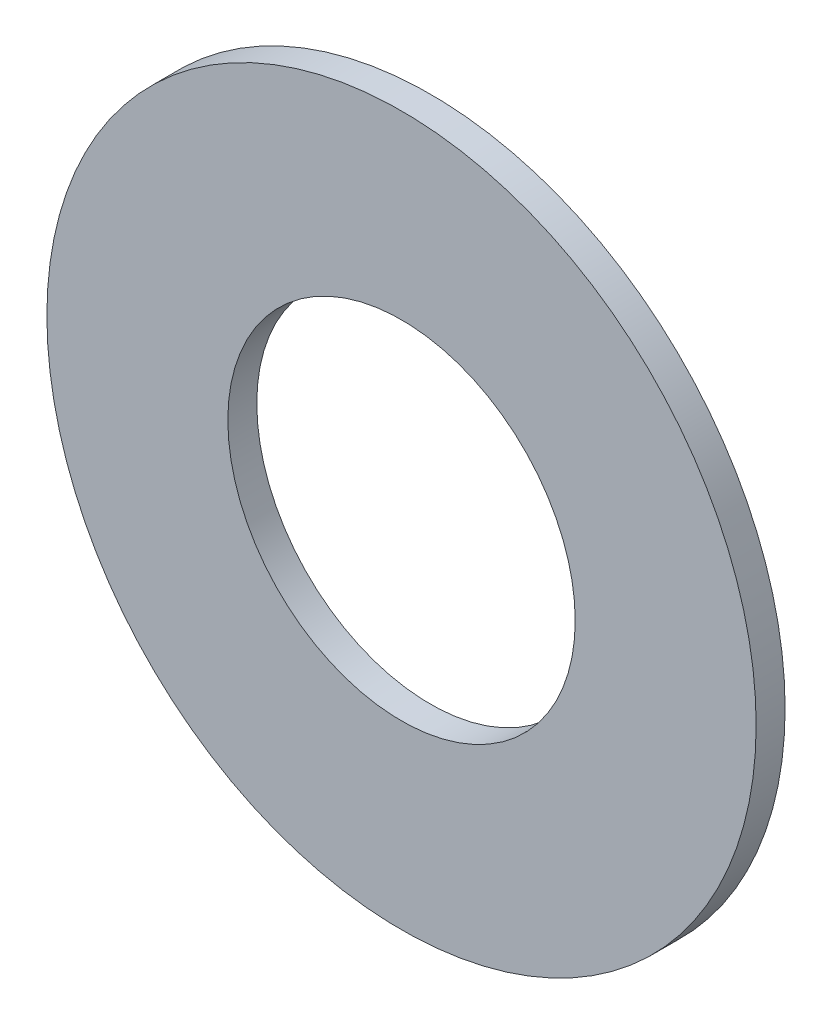
ISO-10303-21;
HEADER;
FILE_DESCRIPTION(('STEP AP214'),'2;1');
FILE_NAME('part.step','',(''),(''),'','','');
FILE_SCHEMA(('AUTOMOTIVE_DESIGN { 1 0 10303 214 1 1 1 1 }'));
ENDSEC;
DATA;
#1=APPLICATION_CONTEXT('core data for automotive mechanical design processes');
#2=APPLICATION_PROTOCOL_DEFINITION('international standard','automotive_design',2000,#1);
#3=PRODUCT_CONTEXT('',#1,'mechanical');
#4=PRODUCT('Part','Part','',(#3));
#5=PRODUCT_RELATED_PRODUCT_CATEGORY('part','',(#4));
#6=PRODUCT_DEFINITION_FORMATION('','',#4);
#7=PRODUCT_DEFINITION_CONTEXT('part definition',#1,'design');
#8=PRODUCT_DEFINITION('design','',#6,#7);
#9=PRODUCT_DEFINITION_SHAPE('','',#8);
#10=(LENGTH_UNIT() NAMED_UNIT(*) SI_UNIT(.MILLI.,.METRE.));
#11=(NAMED_UNIT(*) PLANE_ANGLE_UNIT() SI_UNIT($,.RADIAN.));
#12=(NAMED_UNIT(*) SI_UNIT($,.STERADIAN.) SOLID_ANGLE_UNIT());
#13=UNCERTAINTY_MEASURE_WITH_UNIT(LENGTH_MEASURE(1.E-05),#10,'distance_accuracy_value','');
#14=(GEOMETRIC_REPRESENTATION_CONTEXT(3) GLOBAL_UNCERTAINTY_ASSIGNED_CONTEXT((#13)) GLOBAL_UNIT_ASSIGNED_CONTEXT((#10,
#11,#12)) REPRESENTATION_CONTEXT('',''));
#15=CARTESIAN_POINT('',(0.,0.,0.));
#16=DIRECTION('',(0.,0.,1.));
#17=DIRECTION('',(1.,0.,0.));
#18=AXIS2_PLACEMENT_3D('',#15,#16,#17);
#19=CARTESIAN_POINT('',(0.,0.,1.));
#20=DIRECTION('',(0.,0.,1.));
#21=DIRECTION('',(1.,0.,0.));
#22=AXIS2_PLACEMENT_3D('',#19,#20,#21);
#23=PLANE('',#22);
#24=CARTESIAN_POINT('',(0.,0.,1.));
#25=DIRECTION('',(0.,0.,1.));
#26=DIRECTION('',(1.,0.,0.));
#27=AXIS2_PLACEMENT_3D('',#24,#25,#26);
#28=CIRCLE('',#27,12.25);
#29=CARTESIAN_POINT('',(12.25,0.,1.));
#30=VERTEX_POINT('',#29);
#31=EDGE_CURVE('E10',#30,#30,#28,.T.);
#32=ORIENTED_EDGE('',*,*,#31,.T.);
#33=EDGE_LOOP('',(#32));
#34=FACE_BOUND('',#33,.T.);
#35=CARTESIAN_POINT('',(0.,0.,1.));
#36=DIRECTION('',(0.,0.,1.));
#37=DIRECTION('',(1.,0.,0.));
#38=AXIS2_PLACEMENT_3D('',#35,#36,#37);
#39=CIRCLE('',#38,6.);
#40=CARTESIAN_POINT('',(6.,0.,1.));
#41=VERTEX_POINT('',#40);
#42=EDGE_CURVE('E46',#41,#41,#39,.T.);
#43=ORIENTED_EDGE('',*,*,#42,.F.);
#44=EDGE_LOOP('',(#43));
#45=FACE_BOUND('',#44,.T.);
#46=ADVANCED_FACE('F35',(#34,#45),#23,.T.);
#47=CARTESIAN_POINT('',(0.,0.,0.));
#48=DIRECTION('',(0.,0.,1.));
#49=DIRECTION('',(1.,0.,0.));
#50=AXIS2_PLACEMENT_3D('',#47,#48,#49);
#51=PLANE('',#50);
#52=CARTESIAN_POINT('',(0.,0.,0.));
#53=DIRECTION('',(0.,0.,1.));
#54=DIRECTION('',(1.,0.,0.));
#55=AXIS2_PLACEMENT_3D('',#52,#53,#54);
#56=CIRCLE('',#55,12.25);
#57=CARTESIAN_POINT('',(12.25,0.,0.));
#58=VERTEX_POINT('',#57);
#59=EDGE_CURVE('E39',#58,#58,#56,.T.);
#60=ORIENTED_EDGE('',*,*,#59,.F.);
#61=EDGE_LOOP('',(#60));
#62=FACE_BOUND('',#61,.T.);
#63=CARTESIAN_POINT('',(0.,0.,0.));
#64=DIRECTION('',(0.,0.,1.));
#65=DIRECTION('',(1.,0.,0.));
#66=AXIS2_PLACEMENT_3D('',#63,#64,#65);
#67=CIRCLE('',#66,6.);
#68=CARTESIAN_POINT('',(6.,0.,0.));
#69=VERTEX_POINT('',#68);
#70=EDGE_CURVE('E48',#69,#69,#67,.T.);
#71=ORIENTED_EDGE('',*,*,#70,.T.);
#72=EDGE_LOOP('',(#71));
#73=FACE_BOUND('',#72,.T.);
#74=ADVANCED_FACE('F58',(#62,#73),#51,.F.);
#75=CARTESIAN_POINT('',(0.,0.,1.));
#76=DIRECTION('',(0.,0.,-1.));
#77=DIRECTION('',(-1.,0.,0.));
#78=AXIS2_PLACEMENT_3D('',#75,#76,#77);
#79=CYLINDRICAL_SURFACE('',#78,12.25);
#80=ORIENTED_EDGE('',*,*,#31,.F.);
#81=EDGE_LOOP('',(#80));
#82=FACE_BOUND('',#81,.T.);
#83=ORIENTED_EDGE('',*,*,#59,.T.);
#84=EDGE_LOOP('',(#83));
#85=FACE_BOUND('',#84,.T.);
#86=ADVANCED_FACE('F37',(#82,#85),#79,.T.);
#87=CARTESIAN_POINT('',(0.,0.,1.));
#88=DIRECTION('',(0.,0.,-1.));
#89=DIRECTION('',(-1.,0.,0.));
#90=AXIS2_PLACEMENT_3D('',#87,#88,#89);
#91=CYLINDRICAL_SURFACE('',#90,6.);
#92=ORIENTED_EDGE('',*,*,#42,.T.);
#93=EDGE_LOOP('',(#92));
#94=FACE_BOUND('',#93,.T.);
#95=ORIENTED_EDGE('',*,*,#70,.F.);
#96=EDGE_LOOP('',(#95));
#97=FACE_BOUND('',#96,.T.);
#98=ADVANCED_FACE('F54',(#94,#97),#91,.F.);
#99=CLOSED_SHELL('',(#46,#74,#86,#98));
#100=MANIFOLD_SOLID_BREP('B2',#99);
#101=ADVANCED_BREP_SHAPE_REPRESENTATION('',(#18,#100),#14);
#102=SHAPE_DEFINITION_REPRESENTATION(#9,#101);
ENDSEC;
END-ISO-10303-21;
